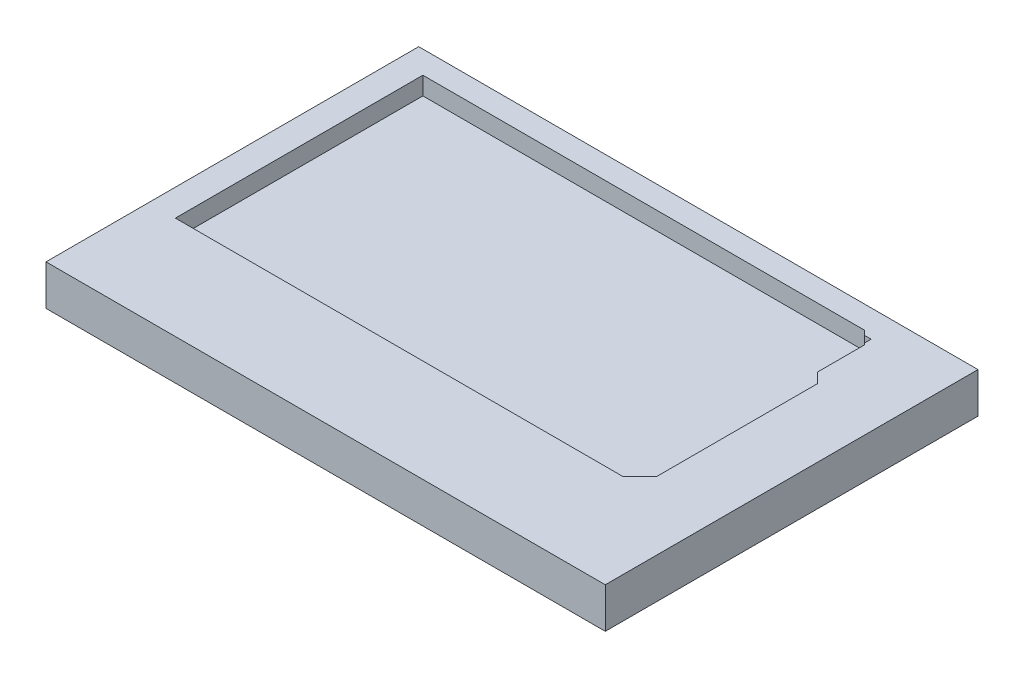
ISO-10303-21;
HEADER;
FILE_DESCRIPTION(('STEP AP214'),'2;1');
FILE_NAME('part.step','',(''),(''),'','','');
FILE_SCHEMA(('AUTOMOTIVE_DESIGN { 1 0 10303 214 1 1 1 1 }'));
ENDSEC;
DATA;
#1=APPLICATION_CONTEXT('core data for automotive mechanical design processes');
#2=APPLICATION_PROTOCOL_DEFINITION('international standard','automotive_design',2000,#1);
#3=PRODUCT_CONTEXT('',#1,'mechanical');
#4=PRODUCT('Part','Part','',(#3));
#5=PRODUCT_RELATED_PRODUCT_CATEGORY('part','',(#4));
#6=PRODUCT_DEFINITION_FORMATION('','',#4);
#7=PRODUCT_DEFINITION_CONTEXT('part definition',#1,'design');
#8=PRODUCT_DEFINITION('design','',#6,#7);
#9=PRODUCT_DEFINITION_SHAPE('','',#8);
#10=(LENGTH_UNIT() NAMED_UNIT(*) SI_UNIT(.MILLI.,.METRE.));
#11=(NAMED_UNIT(*) PLANE_ANGLE_UNIT() SI_UNIT($,.RADIAN.));
#12=(NAMED_UNIT(*) SI_UNIT($,.STERADIAN.) SOLID_ANGLE_UNIT());
#13=UNCERTAINTY_MEASURE_WITH_UNIT(LENGTH_MEASURE(1.E-05),#10,'distance_accuracy_value','');
#14=(GEOMETRIC_REPRESENTATION_CONTEXT(3) GLOBAL_UNCERTAINTY_ASSIGNED_CONTEXT((#13)) GLOBAL_UNIT_ASSIGNED_CONTEXT((#10,
#11,#12)) REPRESENTATION_CONTEXT('',''));
#15=CARTESIAN_POINT('',(0.,0.,0.));
#16=DIRECTION('',(0.,0.,1.));
#17=DIRECTION('',(1.,0.,0.));
#18=AXIS2_PLACEMENT_3D('',#15,#16,#17);
#19=CARTESIAN_POINT('',(0.,5.,0.));
#20=DIRECTION('',(0.,-1.,0.));
#21=DIRECTION('',(0.,0.,-1.));
#22=AXIS2_PLACEMENT_3D('',#19,#20,#21);
#23=PLANE('',#22);
#24=DIRECTION('',(0.707106781186545,0.,0.707106781186551));
#25=VECTOR('',#24,1.);
#26=CARTESIAN_POINT('',(37.4915416658099,5.,-37.4915416658095));
#27=LINE('',#26,#25);
#28=CARTESIAN_POINT('',(50.,5.,-24.9830833316193));
#29=VERTEX_POINT('',#28);
#30=CARTESIAN_POINT('',(50.3548697692464,5.,-24.6282135623729));
#31=VERTEX_POINT('',#30);
#32=EDGE_CURVE('E142',#29,#31,#27,.T.);
#33=ORIENTED_EDGE('',*,*,#32,.F.);
#34=DIRECTION('',(0.,0.,1.));
#35=VECTOR('',#34,1.);
#36=CARTESIAN_POINT('',(50.,5.,0.));
#37=LINE('',#36,#35);
#38=CARTESIAN_POINT('',(50.,5.,-26.5));
#39=VERTEX_POINT('',#38);
#40=EDGE_CURVE('E48',#39,#29,#37,.T.);
#41=ORIENTED_EDGE('',*,*,#40,.F.);
#42=DIRECTION('',(-1.,0.,0.));
#43=VECTOR('',#42,1.);
#44=CARTESIAN_POINT('',(-50.,5.,-26.5));
#45=LINE('',#44,#43);
#46=CARTESIAN_POINT('',(48.4830833316193,5.,-26.5));
#47=VERTEX_POINT('',#46);
#48=EDGE_CURVE('E11',#39,#47,#45,.T.);
#49=ORIENTED_EDGE('',*,*,#48,.T.);
#50=DIRECTION('',(0.707106781186545,0.,0.707106781186551));
#51=VECTOR('',#50,1.);
#52=CARTESIAN_POINT('',(37.4915416658099,5.,-37.4915416658095));
#53=LINE('',#52,#51);
#54=CARTESIAN_POINT('',(47.4830833316194,5.,-27.5));
#55=VERTEX_POINT('',#54);
#56=EDGE_CURVE('E231',#55,#47,#53,.T.);
#57=ORIENTED_EDGE('',*,*,#56,.F.);
#58=DIRECTION('',(1.,0.,0.));
#59=VECTOR('',#58,1.);
#60=CARTESIAN_POINT('',(0.,5.,-27.5));
#61=LINE('',#60,#59);
#62=CARTESIAN_POINT('',(-51.0000000000001,5.,-27.5));
#63=VERTEX_POINT('',#62);
#64=EDGE_CURVE('E278',#63,#55,#61,.T.);
#65=ORIENTED_EDGE('',*,*,#64,.F.);
#66=DIRECTION('',(0.,0.,-1.));
#67=VECTOR('',#66,1.);
#68=CARTESIAN_POINT('',(-51.0000000000001,5.,0.));
#69=LINE('',#68,#67);
#70=CARTESIAN_POINT('',(-51.0000000000001,5.,27.7130000000002));
#71=VERTEX_POINT('',#70);
#72=EDGE_CURVE('E282',#71,#63,#69,.T.);
#73=ORIENTED_EDGE('',*,*,#72,.F.);
#74=DIRECTION('',(-1.,0.,0.));
#75=VECTOR('',#74,1.);
#76=CARTESIAN_POINT('',(0.,5.,27.7130000000002));
#77=LINE('',#76,#75);
#78=CARTESIAN_POINT('',(48.839213562373,5.,27.7130000000002));
#79=VERTEX_POINT('',#78);
#80=EDGE_CURVE('E286',#79,#71,#77,.T.);
#81=ORIENTED_EDGE('',*,*,#80,.F.);
#82=DIRECTION('',(-0.707106781186548,0.,0.707106781186547));
#83=VECTOR('',#82,1.);
#84=CARTESIAN_POINT('',(38.2761067811866,5.,38.2761067811866));
#85=LINE('',#84,#83);
#86=CARTESIAN_POINT('',(52.6,5.,23.9522135623732));
#87=VERTEX_POINT('',#86);
#88=EDGE_CURVE('E290',#87,#79,#85,.T.);
#89=ORIENTED_EDGE('',*,*,#88,.F.);
#90=DIRECTION('',(0.,0.,1.));
#91=VECTOR('',#90,1.);
#92=CARTESIAN_POINT('',(52.6,5.,0.));
#93=LINE('',#92,#91);
#94=CARTESIAN_POINT('',(52.6,5.,-11.9398165272339));
#95=VERTEX_POINT('',#94);
#96=EDGE_CURVE('E294',#95,#87,#93,.T.);
#97=ORIENTED_EDGE('',*,*,#96,.F.);
#98=DIRECTION('',(0.707106781186548,0.,0.707106781186548));
#99=VECTOR('',#98,1.);
#100=CARTESIAN_POINT('',(32.269908263617,5.,-32.269908263617));
#101=LINE('',#100,#99);
#102=CARTESIAN_POINT('',(50.3548697692464,5.,-14.1849467579875));
#103=VERTEX_POINT('',#102);
#104=EDGE_CURVE('E298',#103,#95,#101,.T.);
#105=ORIENTED_EDGE('',*,*,#104,.F.);
#106=DIRECTION('',(0.,0.,1.));
#107=VECTOR('',#106,1.);
#108=CARTESIAN_POINT('',(50.3548697692464,5.,0.));
#109=LINE('',#108,#107);
#110=EDGE_CURVE('E55',#31,#103,#109,.T.);
#111=ORIENTED_EDGE('',*,*,#110,.F.);
#112=EDGE_LOOP('',(#33,#41,#49,#57,#65,#73,#81,#89,#97,#105,#111));
#113=FACE_BOUND('',#112,.T.);
#114=ADVANCED_FACE('F39',(#113),#23,.F.);
#115=CARTESIAN_POINT('',(0.,0.,0.));
#116=DIRECTION('',(0.,-1.,0.));
#117=DIRECTION('',(0.,0.,-1.));
#118=AXIS2_PLACEMENT_3D('',#115,#116,#117);
#119=PLANE('',#118);
#120=DIRECTION('',(1.,0.,0.));
#121=VECTOR('',#120,1.);
#122=CARTESIAN_POINT('',(0.,0.,-32.5502318479835));
#123=LINE('',#122,#121);
#124=CARTESIAN_POINT('',(-56.9779746245312,0.,-32.5502318479835));
#125=VERTEX_POINT('',#124);
#126=CARTESIAN_POINT('',(67.7815745040234,0.,-32.5502318479835));
#127=VERTEX_POINT('',#126);
#128=EDGE_CURVE('E227',#125,#127,#123,.T.);
#129=ORIENTED_EDGE('',*,*,#128,.T.);
#130=DIRECTION('',(0.,0.,1.));
#131=VECTOR('',#130,1.);
#132=CARTESIAN_POINT('',(67.7815745040234,0.,0.));
#133=LINE('',#132,#131);
#134=CARTESIAN_POINT('',(67.7815745040234,0.,50.5912166137406));
#135=VERTEX_POINT('',#134);
#136=EDGE_CURVE('E223',#127,#135,#133,.T.);
#137=ORIENTED_EDGE('',*,*,#136,.T.);
#138=DIRECTION('',(1.,0.,0.));
#139=VECTOR('',#138,1.);
#140=CARTESIAN_POINT('',(0.,0.,50.5912166137406));
#141=LINE('',#140,#139);
#142=CARTESIAN_POINT('',(-56.9779746245312,0.,50.5912166137406));
#143=VERTEX_POINT('',#142);
#144=EDGE_CURVE('E219',#143,#135,#141,.T.);
#145=ORIENTED_EDGE('',*,*,#144,.F.);
#146=DIRECTION('',(0.,0.,1.));
#147=VECTOR('',#146,1.);
#148=CARTESIAN_POINT('',(-56.9779746245312,0.,0.));
#149=LINE('',#148,#147);
#150=EDGE_CURVE('E214',#125,#143,#149,.T.);
#151=ORIENTED_EDGE('',*,*,#150,.F.);
#152=EDGE_LOOP('',(#129,#137,#145,#151));
#153=FACE_BOUND('',#152,.T.);
#154=ADVANCED_FACE('F41',(#153),#119,.T.);
#155=CARTESIAN_POINT('',(0.,9.,-26.5));
#156=DIRECTION('',(0.,0.,-1.));
#157=DIRECTION('',(-1.,0.,0.));
#158=AXIS2_PLACEMENT_3D('',#155,#156,#157);
#159=PLANE('',#158);
#160=DIRECTION('',(0.,-1.,0.));
#161=VECTOR('',#160,1.);
#162=CARTESIAN_POINT('',(48.4830833316193,9.,-26.5));
#163=LINE('',#162,#161);
#164=CARTESIAN_POINT('',(48.4830833316193,9.,-26.5));
#165=VERTEX_POINT('',#164);
#166=EDGE_CURVE('E167',#165,#47,#163,.T.);
#167=ORIENTED_EDGE('',*,*,#166,.T.);
#168=ORIENTED_EDGE('',*,*,#48,.F.);
#169=DIRECTION('',(0.,-1.,0.));
#170=VECTOR('',#169,1.);
#171=CARTESIAN_POINT('',(50.,9.,-26.5));
#172=LINE('',#171,#170);
#173=CARTESIAN_POINT('',(50.,9.,-26.5));
#174=VERTEX_POINT('',#173);
#175=EDGE_CURVE('E157',#174,#39,#172,.T.);
#176=ORIENTED_EDGE('',*,*,#175,.F.);
#177=DIRECTION('',(1.,0.,0.));
#178=VECTOR('',#177,1.);
#179=CARTESIAN_POINT('',(0.,9.,-26.5));
#180=LINE('',#179,#178);
#181=EDGE_CURVE('E265',#165,#174,#180,.T.);
#182=ORIENTED_EDGE('',*,*,#181,.F.);
#183=EDGE_LOOP('',(#167,#168,#176,#182));
#184=FACE_BOUND('',#183,.T.);
#185=ADVANCED_FACE('F318',(#184),#159,.F.);
#186=CARTESIAN_POINT('',(50.,9.,0.));
#187=DIRECTION('',(1.,0.,0.));
#188=DIRECTION('',(0.,0.,-1.));
#189=AXIS2_PLACEMENT_3D('',#186,#187,#188);
#190=PLANE('',#189);
#191=ORIENTED_EDGE('',*,*,#175,.T.);
#192=ORIENTED_EDGE('',*,*,#40,.T.);
#193=DIRECTION('',(0.,-1.,0.));
#194=VECTOR('',#193,1.);
#195=CARTESIAN_POINT('',(50.,9.,-24.9830833316193));
#196=LINE('',#195,#194);
#197=CARTESIAN_POINT('',(50.,9.,-24.9830833316193));
#198=VERTEX_POINT('',#197);
#199=EDGE_CURVE('E154',#198,#29,#196,.T.);
#200=ORIENTED_EDGE('',*,*,#199,.F.);
#201=DIRECTION('',(0.,0.,1.));
#202=VECTOR('',#201,1.);
#203=CARTESIAN_POINT('',(50.,9.,0.));
#204=LINE('',#203,#202);
#205=EDGE_CURVE('E268',#174,#198,#204,.T.);
#206=ORIENTED_EDGE('',*,*,#205,.F.);
#207=EDGE_LOOP('',(#191,#192,#200,#206));
#208=FACE_BOUND('',#207,.T.);
#209=ADVANCED_FACE('F152',(#208),#190,.F.);
#210=CARTESIAN_POINT('',(0.,9.,-32.5502318479835));
#211=DIRECTION('',(0.,0.,-1.));
#212=DIRECTION('',(-1.,0.,0.));
#213=AXIS2_PLACEMENT_3D('',#210,#211,#212);
#214=PLANE('',#213);
#215=DIRECTION('',(0.,-1.,0.));
#216=VECTOR('',#215,1.);
#217=CARTESIAN_POINT('',(67.7815745040234,9.,-32.5502318479835));
#218=LINE('',#217,#216);
#219=CARTESIAN_POINT('',(67.7815745040234,9.,-32.5502318479835));
#220=VERTEX_POINT('',#219);
#221=EDGE_CURVE('E203',#220,#127,#218,.T.);
#222=ORIENTED_EDGE('',*,*,#221,.T.);
#223=ORIENTED_EDGE('',*,*,#128,.F.);
#224=DIRECTION('',(0.,-1.,0.));
#225=VECTOR('',#224,1.);
#226=CARTESIAN_POINT('',(-56.9779746245312,9.,-32.5502318479835));
#227=LINE('',#226,#225);
#228=CARTESIAN_POINT('',(-56.9779746245312,9.,-32.5502318479835));
#229=VERTEX_POINT('',#228);
#230=EDGE_CURVE('E159',#229,#125,#227,.T.);
#231=ORIENTED_EDGE('',*,*,#230,.F.);
#232=DIRECTION('',(1.,0.,0.));
#233=VECTOR('',#232,1.);
#234=CARTESIAN_POINT('',(0.,9.,-32.5502318479835));
#235=LINE('',#234,#233);
#236=EDGE_CURVE('E242',#229,#220,#235,.T.);
#237=ORIENTED_EDGE('',*,*,#236,.T.);
#238=EDGE_LOOP('',(#222,#223,#231,#237));
#239=FACE_BOUND('',#238,.T.);
#240=ADVANCED_FACE('F347',(#239),#214,.T.);
#241=CARTESIAN_POINT('',(-56.9779746245312,9.,0.));
#242=DIRECTION('',(1.,0.,0.));
#243=DIRECTION('',(0.,0.,-1.));
#244=AXIS2_PLACEMENT_3D('',#241,#242,#243);
#245=PLANE('',#244);
#246=ORIENTED_EDGE('',*,*,#230,.T.);
#247=ORIENTED_EDGE('',*,*,#150,.T.);
#248=DIRECTION('',(0.,-1.,0.));
#249=VECTOR('',#248,1.);
#250=CARTESIAN_POINT('',(-56.9779746245312,9.,50.5912166137406));
#251=LINE('',#250,#249);
#252=CARTESIAN_POINT('',(-56.9779746245312,9.,50.5912166137406));
#253=VERTEX_POINT('',#252);
#254=EDGE_CURVE('E209',#253,#143,#251,.T.);
#255=ORIENTED_EDGE('',*,*,#254,.F.);
#256=DIRECTION('',(0.,0.,1.));
#257=VECTOR('',#256,1.);
#258=CARTESIAN_POINT('',(-56.9779746245312,9.,0.));
#259=LINE('',#258,#257);
#260=EDGE_CURVE('E169',#229,#253,#259,.T.);
#261=ORIENTED_EDGE('',*,*,#260,.F.);
#262=EDGE_LOOP('',(#246,#247,#255,#261));
#263=FACE_BOUND('',#262,.T.);
#264=ADVANCED_FACE('F363',(#263),#245,.F.);
#265=CARTESIAN_POINT('',(0.,9.,50.5912166137406));
#266=DIRECTION('',(0.,0.,-1.));
#267=DIRECTION('',(-1.,0.,0.));
#268=AXIS2_PLACEMENT_3D('',#265,#266,#267);
#269=PLANE('',#268);
#270=ORIENTED_EDGE('',*,*,#254,.T.);
#271=ORIENTED_EDGE('',*,*,#144,.T.);
#272=DIRECTION('',(0.,-1.,0.));
#273=VECTOR('',#272,1.);
#274=CARTESIAN_POINT('',(67.7815745040234,9.,50.5912166137406));
#275=LINE('',#274,#273);
#276=CARTESIAN_POINT('',(67.7815745040234,9.,50.5912166137406));
#277=VERTEX_POINT('',#276);
#278=EDGE_CURVE('E206',#277,#135,#275,.T.);
#279=ORIENTED_EDGE('',*,*,#278,.F.);
#280=DIRECTION('',(1.,0.,0.));
#281=VECTOR('',#280,1.);
#282=CARTESIAN_POINT('',(0.,9.,50.5912166137406));
#283=LINE('',#282,#281);
#284=EDGE_CURVE('E235',#253,#277,#283,.T.);
#285=ORIENTED_EDGE('',*,*,#284,.F.);
#286=EDGE_LOOP('',(#270,#271,#279,#285));
#287=FACE_BOUND('',#286,.T.);
#288=ADVANCED_FACE('F345',(#287),#269,.F.);
#289=CARTESIAN_POINT('',(50.3548697692464,9.,0.));
#290=DIRECTION('',(1.,0.,0.));
#291=DIRECTION('',(0.,0.,-1.));
#292=AXIS2_PLACEMENT_3D('',#289,#290,#291);
#293=PLANE('',#292);
#294=DIRECTION('',(0.,-1.,0.));
#295=VECTOR('',#294,1.);
#296=CARTESIAN_POINT('',(50.3548697692464,9.,-24.6282135623729));
#297=LINE('',#296,#295);
#298=CARTESIAN_POINT('',(50.3548697692464,9.,-24.6282135623729));
#299=VERTEX_POINT('',#298);
#300=EDGE_CURVE('E163',#299,#31,#297,.T.);
#301=ORIENTED_EDGE('',*,*,#300,.T.);
#302=ORIENTED_EDGE('',*,*,#110,.T.);
#303=DIRECTION('',(0.,-1.,0.));
#304=VECTOR('',#303,1.);
#305=CARTESIAN_POINT('',(50.3548697692464,9.,-14.1849467579875));
#306=LINE('',#305,#304);
#307=CARTESIAN_POINT('',(50.3548697692464,9.,-14.1849467579875));
#308=VERTEX_POINT('',#307);
#309=EDGE_CURVE('E199',#308,#103,#306,.T.);
#310=ORIENTED_EDGE('',*,*,#309,.F.);
#311=DIRECTION('',(0.,0.,1.));
#312=VECTOR('',#311,1.);
#313=CARTESIAN_POINT('',(50.3548697692464,9.,0.));
#314=LINE('',#313,#312);
#315=EDGE_CURVE('E218',#299,#308,#314,.T.);
#316=ORIENTED_EDGE('',*,*,#315,.F.);
#317=EDGE_LOOP('',(#301,#302,#310,#316));
#318=FACE_BOUND('',#317,.T.);
#319=ADVANCED_FACE('F305',(#318),#293,.F.);
#320=CARTESIAN_POINT('',(32.269908263617,9.,-32.269908263617));
#321=DIRECTION('',(0.707106781186547,0.,-0.707106781186547));
#322=DIRECTION('',(-0.707106781186548,0.,-0.707106781186548));
#323=AXIS2_PLACEMENT_3D('',#320,#321,#322);
#324=PLANE('',#323);
#325=ORIENTED_EDGE('',*,*,#309,.T.);
#326=ORIENTED_EDGE('',*,*,#104,.T.);
#327=DIRECTION('',(0.,-1.,0.));
#328=VECTOR('',#327,1.);
#329=CARTESIAN_POINT('',(52.6,9.,-11.9398165272339));
#330=LINE('',#329,#328);
#331=CARTESIAN_POINT('',(52.6,9.,-11.9398165272339));
#332=VERTEX_POINT('',#331);
#333=EDGE_CURVE('E195',#332,#95,#330,.T.);
#334=ORIENTED_EDGE('',*,*,#333,.F.);
#335=DIRECTION('',(0.707106781186548,0.,0.707106781186548));
#336=VECTOR('',#335,1.);
#337=CARTESIAN_POINT('',(32.269908263617,9.,-32.269908263617));
#338=LINE('',#337,#336);
#339=EDGE_CURVE('E246',#308,#332,#338,.T.);
#340=ORIENTED_EDGE('',*,*,#339,.F.);
#341=EDGE_LOOP('',(#325,#326,#334,#340));
#342=FACE_BOUND('',#341,.T.);
#343=ADVANCED_FACE('F308',(#342),#324,.F.);
#344=CARTESIAN_POINT('',(52.6,9.,0.));
#345=DIRECTION('',(1.,0.,0.));
#346=DIRECTION('',(0.,0.,-1.));
#347=AXIS2_PLACEMENT_3D('',#344,#345,#346);
#348=PLANE('',#347);
#349=ORIENTED_EDGE('',*,*,#333,.T.);
#350=ORIENTED_EDGE('',*,*,#96,.T.);
#351=DIRECTION('',(0.,-1.,0.));
#352=VECTOR('',#351,1.);
#353=CARTESIAN_POINT('',(52.6,9.,23.9522135623732));
#354=LINE('',#353,#352);
#355=CARTESIAN_POINT('',(52.6,9.,23.9522135623732));
#356=VERTEX_POINT('',#355);
#357=EDGE_CURVE('E191',#356,#87,#354,.T.);
#358=ORIENTED_EDGE('',*,*,#357,.F.);
#359=DIRECTION('',(0.,0.,1.));
#360=VECTOR('',#359,1.);
#361=CARTESIAN_POINT('',(52.6,9.,0.));
#362=LINE('',#361,#360);
#363=EDGE_CURVE('E249',#332,#356,#362,.T.);
#364=ORIENTED_EDGE('',*,*,#363,.F.);
#365=EDGE_LOOP('',(#349,#350,#358,#364));
#366=FACE_BOUND('',#365,.T.);
#367=ADVANCED_FACE('F389',(#366),#348,.F.);
#368=CARTESIAN_POINT('',(38.2761067811866,9.,38.2761067811866));
#369=DIRECTION('',(0.707106781186547,0.,0.707106781186548));
#370=DIRECTION('',(0.707106781186548,0.,-0.707106781186547));
#371=AXIS2_PLACEMENT_3D('',#368,#369,#370);
#372=PLANE('',#371);
#373=ORIENTED_EDGE('',*,*,#357,.T.);
#374=ORIENTED_EDGE('',*,*,#88,.T.);
#375=DIRECTION('',(0.,-1.,0.));
#376=VECTOR('',#375,1.);
#377=CARTESIAN_POINT('',(48.839213562373,9.,27.7130000000002));
#378=LINE('',#377,#376);
#379=CARTESIAN_POINT('',(48.839213562373,9.,27.7130000000002));
#380=VERTEX_POINT('',#379);
#381=EDGE_CURVE('E187',#380,#79,#378,.T.);
#382=ORIENTED_EDGE('',*,*,#381,.F.);
#383=DIRECTION('',(-0.707106781186548,0.,0.707106781186547));
#384=VECTOR('',#383,1.);
#385=CARTESIAN_POINT('',(38.2761067811866,9.,38.2761067811866));
#386=LINE('',#385,#384);
#387=EDGE_CURVE('E252',#356,#380,#386,.T.);
#388=ORIENTED_EDGE('',*,*,#387,.F.);
#389=EDGE_LOOP('',(#373,#374,#382,#388));
#390=FACE_BOUND('',#389,.T.);
#391=ADVANCED_FACE('F396',(#390),#372,.F.);
#392=CARTESIAN_POINT('',(0.,9.,27.7130000000002));
#393=DIRECTION('',(0.,0.,1.));
#394=DIRECTION('',(1.,0.,0.));
#395=AXIS2_PLACEMENT_3D('',#392,#393,#394);
#396=PLANE('',#395);
#397=ORIENTED_EDGE('',*,*,#381,.T.);
#398=ORIENTED_EDGE('',*,*,#80,.T.);
#399=DIRECTION('',(0.,-1.,0.));
#400=VECTOR('',#399,1.);
#401=CARTESIAN_POINT('',(-51.0000000000001,9.,27.7130000000002));
#402=LINE('',#401,#400);
#403=CARTESIAN_POINT('',(-51.0000000000001,9.,27.7130000000002));
#404=VERTEX_POINT('',#403);
#405=EDGE_CURVE('E183',#404,#71,#402,.T.);
#406=ORIENTED_EDGE('',*,*,#405,.F.);
#407=DIRECTION('',(-1.,0.,0.));
#408=VECTOR('',#407,1.);
#409=CARTESIAN_POINT('',(0.,9.,27.7130000000002));
#410=LINE('',#409,#408);
#411=EDGE_CURVE('E255',#380,#404,#410,.T.);
#412=ORIENTED_EDGE('',*,*,#411,.F.);
#413=EDGE_LOOP('',(#397,#398,#406,#412));
#414=FACE_BOUND('',#413,.T.);
#415=ADVANCED_FACE('F404',(#414),#396,.F.);
#416=CARTESIAN_POINT('',(-51.0000000000001,9.,0.));
#417=DIRECTION('',(-1.,0.,0.));
#418=DIRECTION('',(0.,0.,1.));
#419=AXIS2_PLACEMENT_3D('',#416,#417,#418);
#420=PLANE('',#419);
#421=ORIENTED_EDGE('',*,*,#405,.T.);
#422=ORIENTED_EDGE('',*,*,#72,.T.);
#423=DIRECTION('',(0.,-1.,0.));
#424=VECTOR('',#423,1.);
#425=CARTESIAN_POINT('',(-51.0000000000001,9.,-27.5));
#426=LINE('',#425,#424);
#427=CARTESIAN_POINT('',(-51.0000000000001,9.,-27.5));
#428=VERTEX_POINT('',#427);
#429=EDGE_CURVE('E179',#428,#63,#426,.T.);
#430=ORIENTED_EDGE('',*,*,#429,.F.);
#431=DIRECTION('',(0.,0.,-1.));
#432=VECTOR('',#431,1.);
#433=CARTESIAN_POINT('',(-51.0000000000001,9.,0.));
#434=LINE('',#433,#432);
#435=EDGE_CURVE('E258',#404,#428,#434,.T.);
#436=ORIENTED_EDGE('',*,*,#435,.F.);
#437=EDGE_LOOP('',(#421,#422,#430,#436));
#438=FACE_BOUND('',#437,.T.);
#439=ADVANCED_FACE('F334',(#438),#420,.F.);
#440=CARTESIAN_POINT('',(0.,9.,-27.5));
#441=DIRECTION('',(0.,0.,-1.));
#442=DIRECTION('',(-1.,0.,0.));
#443=AXIS2_PLACEMENT_3D('',#440,#441,#442);
#444=PLANE('',#443);
#445=ORIENTED_EDGE('',*,*,#429,.T.);
#446=ORIENTED_EDGE('',*,*,#64,.T.);
#447=DIRECTION('',(0.,-1.,0.));
#448=VECTOR('',#447,1.);
#449=CARTESIAN_POINT('',(47.4830833316194,9.,-27.5));
#450=LINE('',#449,#448);
#451=CARTESIAN_POINT('',(47.4830833316194,9.,-27.5));
#452=VERTEX_POINT('',#451);
#453=EDGE_CURVE('E175',#452,#55,#450,.T.);
#454=ORIENTED_EDGE('',*,*,#453,.F.);
#455=DIRECTION('',(1.,0.,0.));
#456=VECTOR('',#455,1.);
#457=CARTESIAN_POINT('',(0.,9.,-27.5));
#458=LINE('',#457,#456);
#459=EDGE_CURVE('E261',#428,#452,#458,.T.);
#460=ORIENTED_EDGE('',*,*,#459,.F.);
#461=EDGE_LOOP('',(#445,#446,#454,#460));
#462=FACE_BOUND('',#461,.T.);
#463=ADVANCED_FACE('F322',(#462),#444,.F.);
#464=CARTESIAN_POINT('',(37.4915416658099,9.,-37.4915416658095));
#465=DIRECTION('',(0.707106781186551,0.,-0.707106781186545));
#466=DIRECTION('',(-0.707106781186545,0.,-0.707106781186551));
#467=AXIS2_PLACEMENT_3D('',#464,#465,#466);
#468=PLANE('',#467);
#469=ORIENTED_EDGE('',*,*,#453,.T.);
#470=ORIENTED_EDGE('',*,*,#56,.T.);
#471=ORIENTED_EDGE('',*,*,#166,.F.);
#472=DIRECTION('',(0.707106781186545,0.,0.707106781186551));
#473=VECTOR('',#472,1.);
#474=CARTESIAN_POINT('',(37.4915416658099,9.,-37.4915416658095));
#475=LINE('',#474,#473);
#476=EDGE_CURVE('E264',#452,#165,#475,.T.);
#477=ORIENTED_EDGE('',*,*,#476,.F.);
#478=EDGE_LOOP('',(#469,#470,#471,#477));
#479=FACE_BOUND('',#478,.T.);
#480=ADVANCED_FACE('F325',(#479),#468,.F.);
#481=ORIENTED_EDGE('',*,*,#199,.T.);
#482=ORIENTED_EDGE('',*,*,#32,.T.);
#483=ORIENTED_EDGE('',*,*,#300,.F.);
#484=EDGE_CURVE('E161',#198,#299,#475,.T.);
#485=ORIENTED_EDGE('',*,*,#484,.F.);
#486=EDGE_LOOP('',(#481,#482,#483,#485));
#487=FACE_BOUND('',#486,.T.);
#488=ADVANCED_FACE('F160',(#487),#468,.F.);
#489=CARTESIAN_POINT('',(67.7815745040234,9.,0.));
#490=DIRECTION('',(1.,0.,0.));
#491=DIRECTION('',(0.,0.,-1.));
#492=AXIS2_PLACEMENT_3D('',#489,#490,#491);
#493=PLANE('',#492);
#494=ORIENTED_EDGE('',*,*,#278,.T.);
#495=ORIENTED_EDGE('',*,*,#136,.F.);
#496=ORIENTED_EDGE('',*,*,#221,.F.);
#497=DIRECTION('',(0.,0.,1.));
#498=VECTOR('',#497,1.);
#499=CARTESIAN_POINT('',(67.7815745040234,9.,0.));
#500=LINE('',#499,#498);
#501=EDGE_CURVE('E238',#220,#277,#500,.T.);
#502=ORIENTED_EDGE('',*,*,#501,.T.);
#503=EDGE_LOOP('',(#494,#495,#496,#502));
#504=FACE_BOUND('',#503,.T.);
#505=ADVANCED_FACE('F333',(#504),#493,.T.);
#506=CARTESIAN_POINT('',(0.,9.,0.));
#507=DIRECTION('',(0.,-1.,0.));
#508=DIRECTION('',(0.,0.,-1.));
#509=AXIS2_PLACEMENT_3D('',#506,#507,#508);
#510=PLANE('',#509);
#511=ORIENTED_EDGE('',*,*,#315,.T.);
#512=ORIENTED_EDGE('',*,*,#339,.T.);
#513=ORIENTED_EDGE('',*,*,#363,.T.);
#514=ORIENTED_EDGE('',*,*,#387,.T.);
#515=ORIENTED_EDGE('',*,*,#411,.T.);
#516=ORIENTED_EDGE('',*,*,#435,.T.);
#517=ORIENTED_EDGE('',*,*,#459,.T.);
#518=ORIENTED_EDGE('',*,*,#476,.T.);
#519=ORIENTED_EDGE('',*,*,#181,.T.);
#520=ORIENTED_EDGE('',*,*,#205,.T.);
#521=ORIENTED_EDGE('',*,*,#484,.T.);
#522=EDGE_LOOP('',(#511,#512,#513,#514,#515,#516,#517,#518,#519,#520,#521));
#523=FACE_BOUND('',#522,.T.);
#524=ORIENTED_EDGE('',*,*,#236,.F.);
#525=ORIENTED_EDGE('',*,*,#260,.T.);
#526=ORIENTED_EDGE('',*,*,#284,.T.);
#527=ORIENTED_EDGE('',*,*,#501,.F.);
#528=EDGE_LOOP('',(#524,#525,#526,#527));
#529=FACE_BOUND('',#528,.T.);
#530=ADVANCED_FACE('F312',(#523,#529),#510,.F.);
#531=CLOSED_SHELL('',(#114,#154,#185,#209,#240,#264,#288,#319,#343,#367,#391,#415,#439,#463,
#480,#488,#505,#530));
#532=MANIFOLD_SOLID_BREP('B2',#531);
#533=ADVANCED_BREP_SHAPE_REPRESENTATION('',(#18,#532),#14);
#534=SHAPE_DEFINITION_REPRESENTATION(#9,#533);
ENDSEC;
END-ISO-10303-21;
